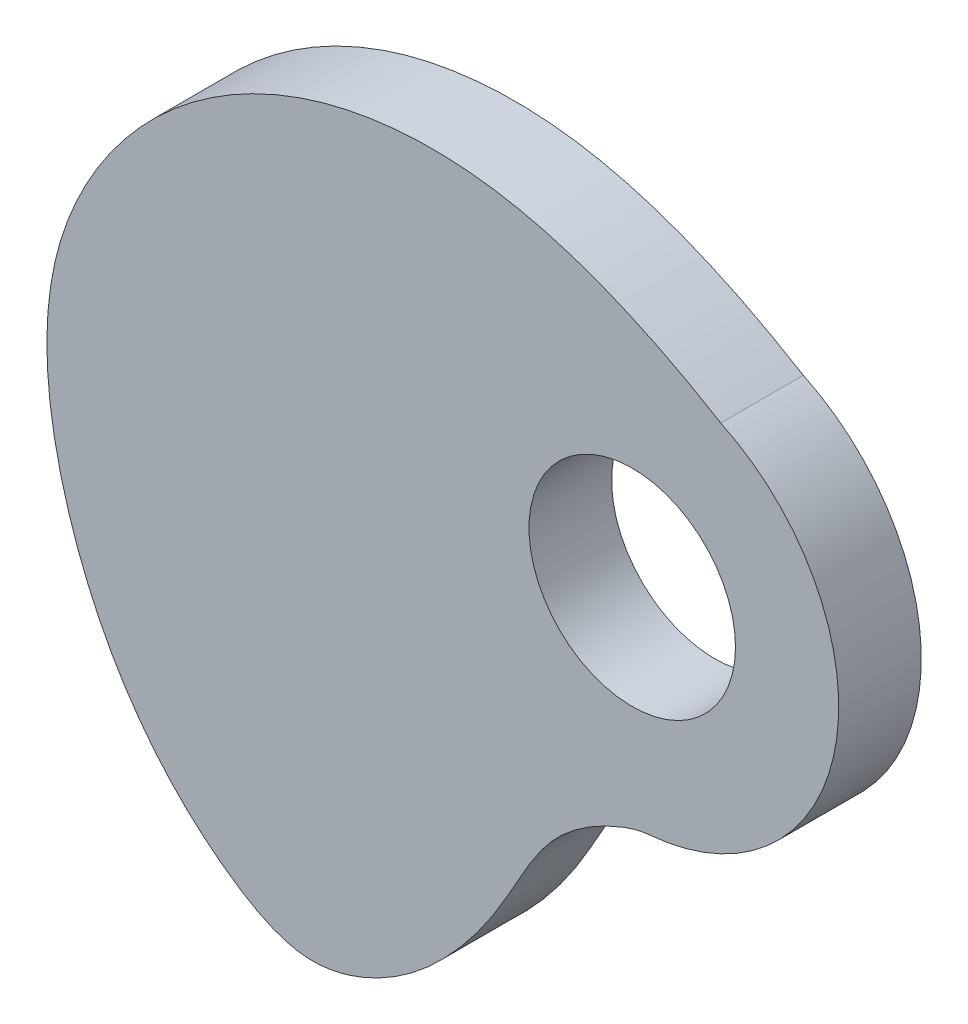
ISO-10303-21;
HEADER;
FILE_DESCRIPTION(('STEP AP214'),'2;1');
FILE_NAME('part.step','',(''),(''),'','','');
FILE_SCHEMA(('AUTOMOTIVE_DESIGN { 1 0 10303 214 1 1 1 1 }'));
ENDSEC;
DATA;
#1=APPLICATION_CONTEXT('core data for automotive mechanical design processes');
#2=APPLICATION_PROTOCOL_DEFINITION('international standard','automotive_design',2000,#1);
#3=PRODUCT_CONTEXT('',#1,'mechanical');
#4=PRODUCT('Part','Part','',(#3));
#5=PRODUCT_RELATED_PRODUCT_CATEGORY('part','',(#4));
#6=PRODUCT_DEFINITION_FORMATION('','',#4);
#7=PRODUCT_DEFINITION_CONTEXT('part definition',#1,'design');
#8=PRODUCT_DEFINITION('design','',#6,#7);
#9=PRODUCT_DEFINITION_SHAPE('','',#8);
#10=(LENGTH_UNIT() NAMED_UNIT(*) SI_UNIT(.MILLI.,.METRE.));
#11=(NAMED_UNIT(*) PLANE_ANGLE_UNIT() SI_UNIT($,.RADIAN.));
#12=(NAMED_UNIT(*) SI_UNIT($,.STERADIAN.) SOLID_ANGLE_UNIT());
#13=UNCERTAINTY_MEASURE_WITH_UNIT(LENGTH_MEASURE(1.E-05),#10,'distance_accuracy_value','');
#14=(GEOMETRIC_REPRESENTATION_CONTEXT(3) GLOBAL_UNCERTAINTY_ASSIGNED_CONTEXT((#13)) GLOBAL_UNIT_ASSIGNED_CONTEXT((#10,
#11,#12)) REPRESENTATION_CONTEXT('',''));
#15=CARTESIAN_POINT('',(0.,0.,0.));
#16=DIRECTION('',(0.,0.,1.));
#17=DIRECTION('',(1.,0.,0.));
#18=AXIS2_PLACEMENT_3D('',#15,#16,#17);
#19=CARTESIAN_POINT('',(10.7142853926462,22.5876977251983,5.));
#20=CARTESIAN_POINT('',(1.97682713303538,27.888880104727,5.));
#21=CARTESIAN_POINT('',(-14.2913951780101,35.1887855203131,5.));
#22=CARTESIAN_POINT('',(-39.9087553624261,33.1443886675136,5.));
#23=CARTESIAN_POINT('',(-59.8923197426763,21.0930318679922,5.));
#24=CARTESIAN_POINT('',(-72.4810831153471,-0.640253309580238,5.));
#25=CARTESIAN_POINT('',(-69.624108687414,-29.6112635217449,5.));
#26=CARTESIAN_POINT('',(-56.7882208149536,-50.6646048454842,5.));
#27=CARTESIAN_POINT('',(-39.7845834755477,-59.7962455842164,5.));
#28=CARTESIAN_POINT('',(-29.771883474187,-56.5749318381557,5.));
#29=CARTESIAN_POINT('',(-21.8150560494556,-49.8936810536305,5.));
#30=CARTESIAN_POINT('',(-15.2997119066928,-41.0122151465406,5.));
#31=CARTESIAN_POINT('',(-10.6898169148148,-31.0056268300158,5.));
#32=CARTESIAN_POINT('',(-3.41344131192362,-26.3747256837204,5.));
#33=CARTESIAN_POINT('',(0.85284127707199,-25.0126391699145,5.));
#34=CARTESIAN_POINT('',(2.01500517433956,-24.9186627680416,5.));
#35=B_SPLINE_CURVE_WITH_KNOTS('',3,(#19,#20,#21,#22,#23,#24,#25,#26,#27,#28,#29,#30,#31,#32,#33,
#34),.UNSPECIFIED.,.F.,.F.,(4,1,1,1,1,1,1,1,1,1,1,1,1,4),(0.,0.138431914512816,
0.230574402084909,0.333853063761961,0.440155636931091,0.547941209537306,0.709692363440458,
0.750139004949358,0.793812962090878,0.839921431497826,0.888980106909028,0.940790065513134,
0.984264013130876,1.),.UNSPECIFIED.);
#36=DIRECTION('',(0.,0.,-1.));
#37=VECTOR('',#36,1.);
#38=SURFACE_OF_LINEAR_EXTRUSION('',#35,#37);
#39=CARTESIAN_POINT('',(10.7142853926462,22.5876977251983,-5.));
#40=CARTESIAN_POINT('',(1.97682713303538,27.888880104727,-5.));
#41=CARTESIAN_POINT('',(-14.2913951780101,35.1887855203131,-5.));
#42=CARTESIAN_POINT('',(-39.9087553624261,33.1443886675136,-5.));
#43=CARTESIAN_POINT('',(-59.8923197426763,21.0930318679922,-5.));
#44=CARTESIAN_POINT('',(-72.4810831153471,-0.640253309580238,-5.));
#45=CARTESIAN_POINT('',(-69.624108687414,-29.6112635217449,-5.));
#46=CARTESIAN_POINT('',(-56.7882208149536,-50.6646048454842,-5.));
#47=CARTESIAN_POINT('',(-39.7845834755477,-59.7962455842164,-5.));
#48=CARTESIAN_POINT('',(-29.771883474187,-56.5749318381557,-5.));
#49=CARTESIAN_POINT('',(-21.8150560494556,-49.8936810536305,-5.));
#50=CARTESIAN_POINT('',(-15.2997119066928,-41.0122151465406,-5.));
#51=CARTESIAN_POINT('',(-10.6898169148148,-31.0056268300158,-5.));
#52=CARTESIAN_POINT('',(-3.41344131192362,-26.3747256837204,-5.));
#53=CARTESIAN_POINT('',(0.85284127707199,-25.0126391699145,-5.));
#54=CARTESIAN_POINT('',(2.01500517433956,-24.9186627680416,-5.));
#55=B_SPLINE_CURVE_WITH_KNOTS('',3,(#39,#40,#41,#42,#43,#44,#45,#46,#47,#48,#49,#50,#51,#52,#53,
#54),.UNSPECIFIED.,.F.,.F.,(4,1,1,1,1,1,1,1,1,1,1,1,1,4),(0.,0.138431914512816,
0.230574402084909,0.333853063761961,0.440155636931091,0.547941209537306,0.709692363440458,
0.750139004949358,0.793812962090878,0.839921431497826,0.888980106909028,0.940790065513134,
0.984264013130876,1.),.UNSPECIFIED.);
#56=CARTESIAN_POINT('',(10.7142853926462,22.5876977251983,-5.));
#57=VERTEX_POINT('',#56);
#58=CARTESIAN_POINT('',(2.01500517433955,-24.9186627680416,-5.));
#59=VERTEX_POINT('',#58);
#60=EDGE_CURVE('E71',#57,#59,#55,.T.);
#61=ORIENTED_EDGE('',*,*,#60,.T.);
#62=DIRECTION('',(0.,0.,-1.));
#63=VECTOR('',#62,1.);
#64=CARTESIAN_POINT('',(2.01500517433955,-24.9186627680416,5.));
#65=LINE('',#64,#63);
#66=CARTESIAN_POINT('',(2.01500517433955,-24.9186627680416,5.));
#67=VERTEX_POINT('',#66);
#68=EDGE_CURVE('E11',#67,#59,#65,.T.);
#69=ORIENTED_EDGE('',*,*,#68,.F.);
#70=CARTESIAN_POINT('',(10.7142853926462,22.5876977251983,5.));
#71=VERTEX_POINT('',#70);
#72=EDGE_CURVE('E70',#71,#67,#35,.T.);
#73=ORIENTED_EDGE('',*,*,#72,.F.);
#74=DIRECTION('',(0.,0.,-1.));
#75=VECTOR('',#74,1.);
#76=CARTESIAN_POINT('',(10.7142853926462,22.5876977251983,5.));
#77=LINE('',#76,#75);
#78=EDGE_CURVE('E48',#71,#57,#77,.T.);
#79=ORIENTED_EDGE('',*,*,#78,.T.);
#80=EDGE_LOOP('',(#61,#69,#73,#79));
#81=FACE_BOUND('',#80,.T.);
#82=ADVANCED_FACE('F39',(#81),#38,.F.);
#83=CARTESIAN_POINT('',(0.,0.,5.));
#84=DIRECTION('',(0.,0.,-1.));
#85=DIRECTION('',(-1.,0.,0.));
#86=AXIS2_PLACEMENT_3D('',#83,#84,#85);
#87=CYLINDRICAL_SURFACE('',#86,25.);
#88=CARTESIAN_POINT('',(0.,0.,-5.));
#89=DIRECTION('',(0.,0.,1.));
#90=DIRECTION('',(1.,0.,0.));
#91=AXIS2_PLACEMENT_3D('',#88,#89,#90);
#92=CIRCLE('',#91,25.);
#93=EDGE_CURVE('E63',#59,#57,#92,.T.);
#94=ORIENTED_EDGE('',*,*,#93,.T.);
#95=ORIENTED_EDGE('',*,*,#78,.F.);
#96=CARTESIAN_POINT('',(0.,0.,5.));
#97=DIRECTION('',(0.,0.,1.));
#98=DIRECTION('',(1.,0.,0.));
#99=AXIS2_PLACEMENT_3D('',#96,#97,#98);
#100=CIRCLE('',#99,25.);
#101=EDGE_CURVE('E55',#67,#71,#100,.T.);
#102=ORIENTED_EDGE('',*,*,#101,.F.);
#103=ORIENTED_EDGE('',*,*,#68,.T.);
#104=EDGE_LOOP('',(#94,#95,#102,#103));
#105=FACE_BOUND('',#104,.T.);
#106=ADVANCED_FACE('F66',(#105),#87,.T.);
#107=CARTESIAN_POINT('',(-70.6525171771526,-14.3384415198877,5.));
#108=DIRECTION('',(0.,0.,-1.));
#109=DIRECTION('',(-1.,0.,0.));
#110=AXIS2_PLACEMENT_3D('',#107,#108,#109);
#111=PLANE('',#110);
#112=CARTESIAN_POINT('',(0.,0.,5.));
#113=DIRECTION('',(0.,0.,1.));
#114=DIRECTION('',(1.,0.,0.));
#115=AXIS2_PLACEMENT_3D('',#112,#113,#114);
#116=CIRCLE('',#115,12.5);
#117=CARTESIAN_POINT('',(12.5,0.,5.));
#118=VERTEX_POINT('',#117);
#119=EDGE_CURVE('E78',#118,#118,#116,.T.);
#120=ORIENTED_EDGE('',*,*,#119,.F.);
#121=EDGE_LOOP('',(#120));
#122=FACE_BOUND('',#121,.T.);
#123=ORIENTED_EDGE('',*,*,#72,.T.);
#124=ORIENTED_EDGE('',*,*,#101,.T.);
#125=EDGE_LOOP('',(#123,#124));
#126=FACE_BOUND('',#125,.T.);
#127=ADVANCED_FACE('F98',(#122,#126),#111,.F.);
#128=CARTESIAN_POINT('',(-70.6525171771526,-14.3384415198877,-5.));
#129=DIRECTION('',(0.,0.,-1.));
#130=DIRECTION('',(-1.,0.,0.));
#131=AXIS2_PLACEMENT_3D('',#128,#129,#130);
#132=PLANE('',#131);
#133=CARTESIAN_POINT('',(0.,0.,-5.));
#134=DIRECTION('',(0.,0.,1.));
#135=DIRECTION('',(1.,0.,0.));
#136=AXIS2_PLACEMENT_3D('',#133,#134,#135);
#137=CIRCLE('',#136,12.5);
#138=CARTESIAN_POINT('',(12.5,0.,-5.));
#139=VERTEX_POINT('',#138);
#140=EDGE_CURVE('E75',#139,#139,#137,.T.);
#141=ORIENTED_EDGE('',*,*,#140,.T.);
#142=EDGE_LOOP('',(#141));
#143=FACE_BOUND('',#142,.T.);
#144=ORIENTED_EDGE('',*,*,#60,.F.);
#145=ORIENTED_EDGE('',*,*,#93,.F.);
#146=EDGE_LOOP('',(#144,#145));
#147=FACE_BOUND('',#146,.T.);
#148=ADVANCED_FACE('F74',(#143,#147),#132,.T.);
#149=CARTESIAN_POINT('',(0.,0.,-5.));
#150=DIRECTION('',(0.,0.,1.));
#151=DIRECTION('',(1.,0.,0.));
#152=AXIS2_PLACEMENT_3D('',#149,#150,#151);
#153=CYLINDRICAL_SURFACE('',#152,12.5);
#154=ORIENTED_EDGE('',*,*,#140,.F.);
#155=EDGE_LOOP('',(#154));
#156=FACE_BOUND('',#155,.T.);
#157=ORIENTED_EDGE('',*,*,#119,.T.);
#158=EDGE_LOOP('',(#157));
#159=FACE_BOUND('',#158,.T.);
#160=ADVANCED_FACE('F96',(#156,#159),#153,.F.);
#161=CLOSED_SHELL('',(#82,#106,#127,#148,#160));
#162=MANIFOLD_SOLID_BREP('B2',#161);
#163=ADVANCED_BREP_SHAPE_REPRESENTATION('',(#18,#162),#14);
#164=SHAPE_DEFINITION_REPRESENTATION(#9,#163);
ENDSEC;
END-ISO-10303-21;
